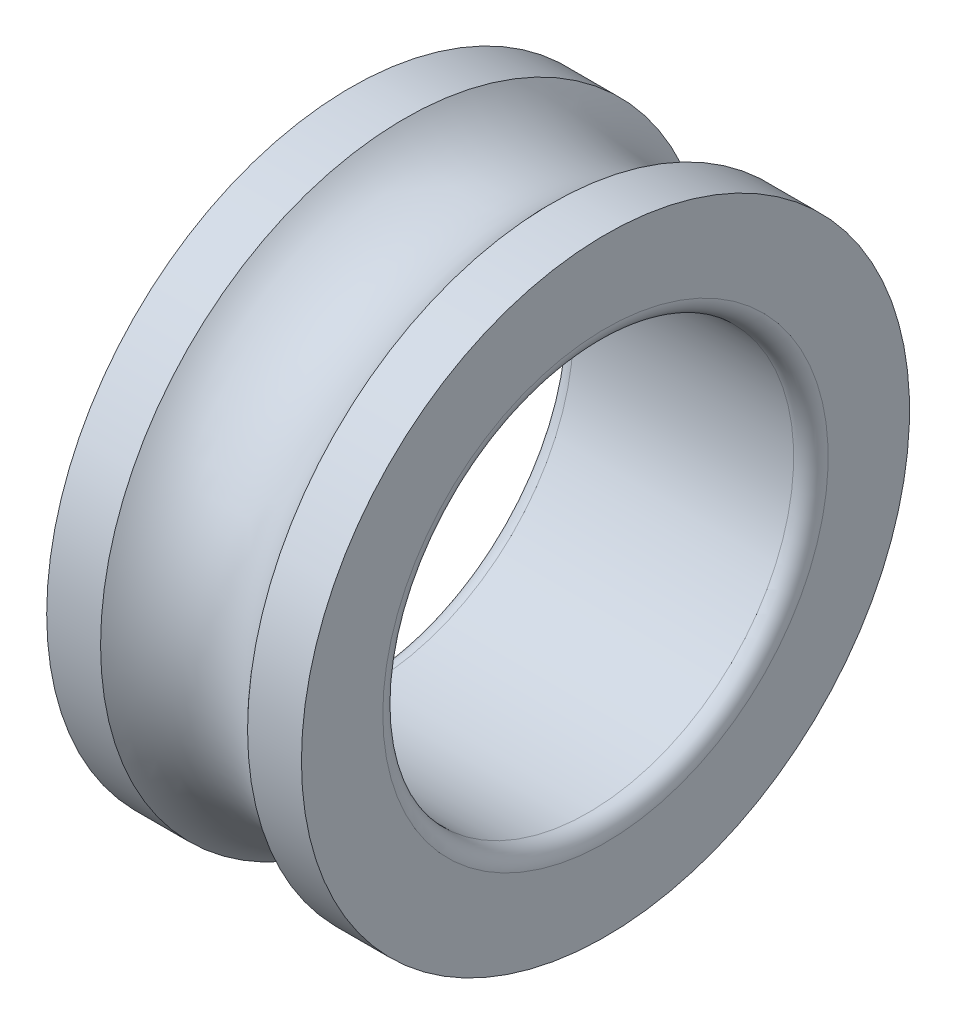
ISO-10303-21;
HEADER;
FILE_DESCRIPTION(('STEP AP214'),'2;1');
FILE_NAME('part.step','',(''),(''),'','','');
FILE_SCHEMA(('AUTOMOTIVE_DESIGN { 1 0 10303 214 1 1 1 1 }'));
ENDSEC;
DATA;
#1=APPLICATION_CONTEXT('core data for automotive mechanical design processes');
#2=APPLICATION_PROTOCOL_DEFINITION('international standard','automotive_design',2000,#1);
#3=PRODUCT_CONTEXT('',#1,'mechanical');
#4=PRODUCT('Part','Part','',(#3));
#5=PRODUCT_RELATED_PRODUCT_CATEGORY('part','',(#4));
#6=PRODUCT_DEFINITION_FORMATION('','',#4);
#7=PRODUCT_DEFINITION_CONTEXT('part definition',#1,'design');
#8=PRODUCT_DEFINITION('design','',#6,#7);
#9=PRODUCT_DEFINITION_SHAPE('','',#8);
#10=(LENGTH_UNIT() NAMED_UNIT(*) SI_UNIT(.MILLI.,.METRE.));
#11=(NAMED_UNIT(*) PLANE_ANGLE_UNIT() SI_UNIT($,.RADIAN.));
#12=(NAMED_UNIT(*) SI_UNIT($,.STERADIAN.) SOLID_ANGLE_UNIT());
#13=UNCERTAINTY_MEASURE_WITH_UNIT(LENGTH_MEASURE(1.E-05),#10,'distance_accuracy_value','');
#14=(GEOMETRIC_REPRESENTATION_CONTEXT(3) GLOBAL_UNCERTAINTY_ASSIGNED_CONTEXT((#13)) GLOBAL_UNIT_ASSIGNED_CONTEXT((#10,
#11,#12)) REPRESENTATION_CONTEXT('',''));
#15=CARTESIAN_POINT('',(0.,0.,0.));
#16=DIRECTION('',(0.,0.,1.));
#17=DIRECTION('',(1.,0.,0.));
#18=AXIS2_PLACEMENT_3D('',#15,#16,#17);
#19=CARTESIAN_POINT('',(-6.34789649759108,6.216,0.));
#20=DIRECTION('',(1.,0.,0.));
#21=DIRECTION('',(0.,0.,-1.));
#22=AXIS2_PLACEMENT_3D('',#19,#20,#21);
#23=PLANE('',#22);
#24=CARTESIAN_POINT('',(-6.34789649759108,0.,0.));
#25=DIRECTION('',(-1.,0.,0.));
#26=DIRECTION('',(0.,0.,1.));
#27=AXIS2_PLACEMENT_3D('',#24,#25,#26);
#28=CIRCLE('',#27,4.5528);
#29=CARTESIAN_POINT('',(-6.34789649759108,0.,4.5528));
#30=VERTEX_POINT('',#29);
#31=EDGE_CURVE('E10',#30,#30,#28,.T.);
#32=ORIENTED_EDGE('',*,*,#31,.F.);
#33=EDGE_LOOP('',(#32));
#34=FACE_BOUND('',#33,.T.);
#35=CARTESIAN_POINT('',(-6.34789649759108,0.,0.));
#36=DIRECTION('',(-1.,0.,0.));
#37=DIRECTION('',(0.,0.,1.));
#38=AXIS2_PLACEMENT_3D('',#35,#36,#37);
#39=CIRCLE('',#38,6.216);
#40=CARTESIAN_POINT('',(-6.34789649759108,0.,6.216));
#41=VERTEX_POINT('',#40);
#42=EDGE_CURVE('E67',#41,#41,#39,.T.);
#43=ORIENTED_EDGE('',*,*,#42,.T.);
#44=EDGE_LOOP('',(#43));
#45=FACE_BOUND('',#44,.T.);
#46=ADVANCED_FACE('F39',(#34,#45),#23,.F.);
#47=CARTESIAN_POINT('',(-5.99509649759108,0.,0.));
#48=DIRECTION('',(-1.,0.,0.));
#49=DIRECTION('',(0.,0.,1.));
#50=AXIS2_PLACEMENT_3D('',#47,#48,#49);
#51=TOROIDAL_SURFACE('',#50,4.5528,0.3528);
#52=CARTESIAN_POINT('',(-5.99509649759108,0.,0.));
#53=DIRECTION('',(-1.,0.,0.));
#54=DIRECTION('',(0.,0.,1.));
#55=AXIS2_PLACEMENT_3D('',#52,#53,#54);
#56=CIRCLE('',#55,4.2);
#57=CARTESIAN_POINT('',(-5.99509649759108,0.,4.2));
#58=VERTEX_POINT('',#57);
#59=EDGE_CURVE('E45',#58,#58,#56,.T.);
#60=ORIENTED_EDGE('',*,*,#59,.F.);
#61=EDGE_LOOP('',(#60));
#62=FACE_BOUND('',#61,.T.);
#63=ORIENTED_EDGE('',*,*,#31,.T.);
#64=EDGE_LOOP('',(#63));
#65=FACE_BOUND('',#64,.T.);
#66=ADVANCED_FACE('F104',(#62,#65),#51,.T.);
#67=CARTESIAN_POINT('',(-8.15066572836031,0.,0.));
#68=DIRECTION('',(-1.,0.,0.));
#69=DIRECTION('',(0.,0.,1.));
#70=AXIS2_PLACEMENT_3D('',#67,#68,#69);
#71=CYLINDRICAL_SURFACE('',#70,4.2);
#72=CARTESIAN_POINT('',(-1.49269649759108,0.,0.));
#73=DIRECTION('',(-1.,0.,0.));
#74=DIRECTION('',(0.,0.,1.));
#75=AXIS2_PLACEMENT_3D('',#72,#73,#74);
#76=CIRCLE('',#75,4.2);
#77=CARTESIAN_POINT('',(-1.49269649759108,0.,4.2));
#78=VERTEX_POINT('',#77);
#79=EDGE_CURVE('E49',#78,#78,#76,.T.);
#80=ORIENTED_EDGE('',*,*,#79,.F.);
#81=EDGE_LOOP('',(#80));
#82=FACE_BOUND('',#81,.T.);
#83=ORIENTED_EDGE('',*,*,#59,.T.);
#84=EDGE_LOOP('',(#83));
#85=FACE_BOUND('',#84,.T.);
#86=ADVANCED_FACE('F99',(#82,#85),#71,.F.);
#87=CARTESIAN_POINT('',(-1.49269649759108,0.,0.));
#88=DIRECTION('',(-1.,0.,0.));
#89=DIRECTION('',(0.,0.,1.));
#90=AXIS2_PLACEMENT_3D('',#87,#88,#89);
#91=TOROIDAL_SURFACE('',#90,4.5528,0.3528);
#92=CARTESIAN_POINT('',(-1.13989649759108,0.,0.));
#93=DIRECTION('',(-1.,0.,0.));
#94=DIRECTION('',(0.,0.,1.));
#95=AXIS2_PLACEMENT_3D('',#92,#93,#94);
#96=CIRCLE('',#95,4.5528);
#97=CARTESIAN_POINT('',(-1.13989649759108,0.,4.5528));
#98=VERTEX_POINT('',#97);
#99=EDGE_CURVE('E53',#98,#98,#96,.T.);
#100=ORIENTED_EDGE('',*,*,#99,.F.);
#101=EDGE_LOOP('',(#100));
#102=FACE_BOUND('',#101,.T.);
#103=ORIENTED_EDGE('',*,*,#79,.T.);
#104=EDGE_LOOP('',(#103));
#105=FACE_BOUND('',#104,.T.);
#106=ADVANCED_FACE('F93',(#102,#105),#91,.T.);
#107=CARTESIAN_POINT('',(-1.13989649759108,6.216,0.));
#108=DIRECTION('',(-1.,0.,0.));
#109=DIRECTION('',(0.,0.,1.));
#110=AXIS2_PLACEMENT_3D('',#107,#108,#109);
#111=PLANE('',#110);
#112=CARTESIAN_POINT('',(-1.13989649759108,0.,0.));
#113=DIRECTION('',(-1.,0.,0.));
#114=DIRECTION('',(0.,0.,1.));
#115=AXIS2_PLACEMENT_3D('',#112,#113,#114);
#116=CIRCLE('',#115,6.216);
#117=CARTESIAN_POINT('',(-1.13989649759108,0.,6.216));
#118=VERTEX_POINT('',#117);
#119=EDGE_CURVE('E58',#118,#118,#116,.T.);
#120=ORIENTED_EDGE('',*,*,#119,.F.);
#121=EDGE_LOOP('',(#120));
#122=FACE_BOUND('',#121,.T.);
#123=ORIENTED_EDGE('',*,*,#99,.T.);
#124=EDGE_LOOP('',(#123));
#125=FACE_BOUND('',#124,.T.);
#126=ADVANCED_FACE('F87',(#122,#125),#111,.F.);
#127=CARTESIAN_POINT('',(-8.15066572836031,0.,0.));
#128=DIRECTION('',(-1.,0.,0.));
#129=DIRECTION('',(0.,0.,1.));
#130=AXIS2_PLACEMENT_3D('',#127,#128,#129);
#131=CYLINDRICAL_SURFACE('',#130,6.216);
#132=CARTESIAN_POINT('',(-2.24125881671122,0.,0.));
#133=DIRECTION('',(-1.,0.,0.));
#134=DIRECTION('',(0.,0.,1.));
#135=AXIS2_PLACEMENT_3D('',#132,#133,#134);
#136=CIRCLE('',#135,6.216);
#137=CARTESIAN_POINT('',(-2.24125881671122,0.,6.216));
#138=VERTEX_POINT('',#137);
#139=EDGE_CURVE('E61',#138,#138,#136,.T.);
#140=ORIENTED_EDGE('',*,*,#139,.F.);
#141=EDGE_LOOP('',(#140));
#142=FACE_BOUND('',#141,.T.);
#143=ORIENTED_EDGE('',*,*,#119,.T.);
#144=EDGE_LOOP('',(#143));
#145=FACE_BOUND('',#144,.T.);
#146=ADVANCED_FACE('F81',(#142,#145),#131,.T.);
#147=CARTESIAN_POINT('',(-3.74389649759108,0.,0.));
#148=DIRECTION('',(-1.,0.,0.));
#149=DIRECTION('',(0.,0.,1.));
#150=AXIS2_PLACEMENT_3D('',#147,#148,#149);
#151=TOROIDAL_SURFACE('',#150,7.56,2.016);
#152=CARTESIAN_POINT('',(-5.24653417847094,0.,0.));
#153=DIRECTION('',(-1.,0.,0.));
#154=DIRECTION('',(0.,0.,1.));
#155=AXIS2_PLACEMENT_3D('',#152,#153,#154);
#156=CIRCLE('',#155,6.216);
#157=CARTESIAN_POINT('',(-5.24653417847094,0.,6.216));
#158=VERTEX_POINT('',#157);
#159=EDGE_CURVE('E64',#158,#158,#156,.T.);
#160=ORIENTED_EDGE('',*,*,#159,.F.);
#161=EDGE_LOOP('',(#160));
#162=FACE_BOUND('',#161,.T.);
#163=ORIENTED_EDGE('',*,*,#139,.T.);
#164=EDGE_LOOP('',(#163));
#165=FACE_BOUND('',#164,.T.);
#166=ADVANCED_FACE('F75',(#162,#165),#151,.F.);
#167=CARTESIAN_POINT('',(-8.15066572836031,0.,0.));
#168=DIRECTION('',(-1.,0.,0.));
#169=DIRECTION('',(0.,0.,1.));
#170=AXIS2_PLACEMENT_3D('',#167,#168,#169);
#171=CYLINDRICAL_SURFACE('',#170,6.216);
#172=ORIENTED_EDGE('',*,*,#42,.F.);
#173=EDGE_LOOP('',(#172));
#174=FACE_BOUND('',#173,.T.);
#175=ORIENTED_EDGE('',*,*,#159,.T.);
#176=EDGE_LOOP('',(#175));
#177=FACE_BOUND('',#176,.T.);
#178=ADVANCED_FACE('F72',(#174,#177),#171,.T.);
#179=CLOSED_SHELL('',(#46,#66,#86,#106,#126,#146,#166,#178));
#180=MANIFOLD_SOLID_BREP('B2',#179);
#181=ADVANCED_BREP_SHAPE_REPRESENTATION('',(#18,#180),#14);
#182=SHAPE_DEFINITION_REPRESENTATION(#9,#181);
ENDSEC;
END-ISO-10303-21;
